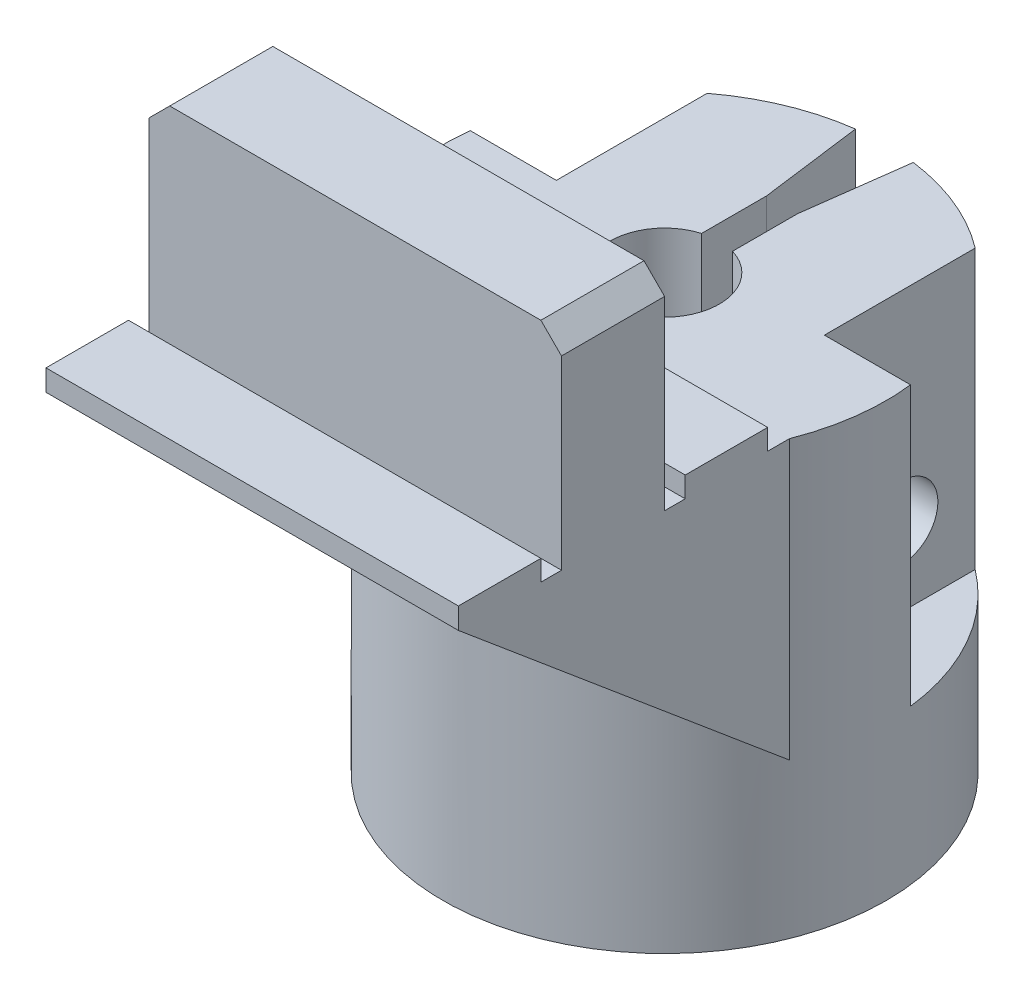
ISO-10303-21;
HEADER;
FILE_DESCRIPTION(('STEP AP214'),'2;1');
FILE_NAME('part.step','',(''),(''),'','','');
FILE_SCHEMA(('AUTOMOTIVE_DESIGN { 1 0 10303 214 1 1 1 1 }'));
ENDSEC;
DATA;
#1=APPLICATION_CONTEXT('core data for automotive mechanical design processes');
#2=APPLICATION_PROTOCOL_DEFINITION('international standard','automotive_design',2000,#1);
#3=PRODUCT_CONTEXT('',#1,'mechanical');
#4=PRODUCT('Part','Part','',(#3));
#5=PRODUCT_RELATED_PRODUCT_CATEGORY('part','',(#4));
#6=PRODUCT_DEFINITION_FORMATION('','',#4);
#7=PRODUCT_DEFINITION_CONTEXT('part definition',#1,'design');
#8=PRODUCT_DEFINITION('design','',#6,#7);
#9=PRODUCT_DEFINITION_SHAPE('','',#8);
#10=(LENGTH_UNIT() NAMED_UNIT(*) SI_UNIT(.MILLI.,.METRE.));
#11=(NAMED_UNIT(*) PLANE_ANGLE_UNIT() SI_UNIT($,.RADIAN.));
#12=(NAMED_UNIT(*) SI_UNIT($,.STERADIAN.) SOLID_ANGLE_UNIT());
#13=UNCERTAINTY_MEASURE_WITH_UNIT(LENGTH_MEASURE(1.E-05),#10,'distance_accuracy_value','');
#14=(GEOMETRIC_REPRESENTATION_CONTEXT(3) GLOBAL_UNCERTAINTY_ASSIGNED_CONTEXT((#13)) GLOBAL_UNIT_ASSIGNED_CONTEXT((#10,
#11,#12)) REPRESENTATION_CONTEXT('',''));
#15=CARTESIAN_POINT('',(0.,0.,0.));
#16=DIRECTION('',(0.,0.,1.));
#17=DIRECTION('',(1.,0.,0.));
#18=AXIS2_PLACEMENT_3D('',#15,#16,#17);
#19=CARTESIAN_POINT('',(0.,22.,0.));
#20=DIRECTION('',(0.,-1.,0.));
#21=DIRECTION('',(0.,0.,-1.));
#22=AXIS2_PLACEMENT_3D('',#19,#20,#21);
#23=PLANE('',#22);
#24=DIRECTION('',(-1.,0.,0.));
#25=VECTOR('',#24,1.);
#26=CARTESIAN_POINT('',(10.75,22.,9.));
#27=LINE('',#26,#25);
#28=CARTESIAN_POINT('',(10.,22.,9.));
#29=VERTEX_POINT('',#28);
#30=CARTESIAN_POINT('',(-10.,22.,9.));
#31=VERTEX_POINT('',#30);
#32=EDGE_CURVE('E269',#29,#31,#27,.T.);
#33=ORIENTED_EDGE('',*,*,#32,.F.);
#34=DIRECTION('',(0.,0.,-1.));
#35=VECTOR('',#34,1.);
#36=CARTESIAN_POINT('',(10.,22.,10.));
#37=LINE('',#36,#35);
#38=CARTESIAN_POINT('',(10.,22.,5.));
#39=VERTEX_POINT('',#38);
#40=EDGE_CURVE('E288',#29,#39,#37,.T.);
#41=ORIENTED_EDGE('',*,*,#40,.T.);
#42=DIRECTION('',(-1.,0.,0.));
#43=VECTOR('',#42,1.);
#44=CARTESIAN_POINT('',(-10.,22.,5.));
#45=LINE('',#44,#43);
#46=CARTESIAN_POINT('',(-10.,22.,5.));
#47=VERTEX_POINT('',#46);
#48=EDGE_CURVE('E289',#39,#47,#45,.T.);
#49=ORIENTED_EDGE('',*,*,#48,.T.);
#50=DIRECTION('',(0.,0.,1.));
#51=VECTOR('',#50,1.);
#52=CARTESIAN_POINT('',(-10.,22.,10.));
#53=LINE('',#52,#51);
#54=EDGE_CURVE('E283',#47,#31,#53,.T.);
#55=ORIENTED_EDGE('',*,*,#54,.T.);
#56=EDGE_LOOP('',(#33,#41,#49,#55));
#57=FACE_BOUND('',#56,.T.);
#58=ADVANCED_FACE('F44',(#57),#23,.F.);
#59=CARTESIAN_POINT('',(-10.,0.,0.));
#60=DIRECTION('',(1.,0.,0.));
#61=DIRECTION('',(0.,0.,-1.));
#62=AXIS2_PLACEMENT_3D('',#59,#60,#61);
#63=PLANE('',#62);
#64=DIRECTION('',(0.,0.,1.));
#65=VECTOR('',#64,1.);
#66=CARTESIAN_POINT('',(-10.,21.,15.));
#67=LINE('',#66,#65);
#68=CARTESIAN_POINT('',(-10.,21.,15.));
#69=VERTEX_POINT('',#68);
#70=CARTESIAN_POINT('',(-10.,21.,16.));
#71=VERTEX_POINT('',#70);
#72=EDGE_CURVE('E281',#69,#71,#67,.T.);
#73=ORIENTED_EDGE('',*,*,#72,.F.);
#74=DIRECTION('',(0.,-1.,0.));
#75=VECTOR('',#74,1.);
#76=CARTESIAN_POINT('',(-10.,31.,15.));
#77=LINE('',#76,#75);
#78=CARTESIAN_POINT('',(-10.,30.,15.));
#79=VERTEX_POINT('',#78);
#80=EDGE_CURVE('E67',#79,#69,#77,.T.);
#81=ORIENTED_EDGE('',*,*,#80,.F.);
#82=DIRECTION('',(0.,0.,-1.));
#83=VECTOR('',#82,1.);
#84=CARTESIAN_POINT('',(-10.,30.,10.));
#85=LINE('',#84,#83);
#86=CARTESIAN_POINT('',(-10.,30.,10.));
#87=VERTEX_POINT('',#86);
#88=EDGE_CURVE('E413',#79,#87,#85,.T.);
#89=ORIENTED_EDGE('',*,*,#88,.T.);
#90=DIRECTION('',(0.,-1.,0.));
#91=VECTOR('',#90,1.);
#92=CARTESIAN_POINT('',(-10.,31.,10.));
#93=LINE('',#92,#91);
#94=CARTESIAN_POINT('',(-10.,21.,10.));
#95=VERTEX_POINT('',#94);
#96=EDGE_CURVE('E299',#87,#95,#93,.T.);
#97=ORIENTED_EDGE('',*,*,#96,.T.);
#98=DIRECTION('',(0.,0.,1.));
#99=VECTOR('',#98,1.);
#100=CARTESIAN_POINT('',(-10.,21.,10.));
#101=LINE('',#100,#99);
#102=CARTESIAN_POINT('',(-10.,21.,9.));
#103=VERTEX_POINT('',#102);
#104=EDGE_CURVE('E271',#103,#95,#101,.T.);
#105=ORIENTED_EDGE('',*,*,#104,.F.);
#106=DIRECTION('',(0.,-1.,0.));
#107=VECTOR('',#106,1.);
#108=CARTESIAN_POINT('',(-10.,22.,9.));
#109=LINE('',#108,#107);
#110=EDGE_CURVE('E63',#31,#103,#109,.T.);
#111=ORIENTED_EDGE('',*,*,#110,.F.);
#112=ORIENTED_EDGE('',*,*,#54,.F.);
#113=DIRECTION('',(0.,-1.,0.));
#114=VECTOR('',#113,1.);
#115=CARTESIAN_POINT('',(-10.,22.,5.));
#116=LINE('',#115,#114);
#117=CARTESIAN_POINT('',(-10.,21.,5.));
#118=VERTEX_POINT('',#117);
#119=EDGE_CURVE('E524',#47,#118,#116,.T.);
#120=ORIENTED_EDGE('',*,*,#119,.T.);
#121=DIRECTION('',(0.,0.,-1.));
#122=VECTOR('',#121,1.);
#123=CARTESIAN_POINT('',(-10.,21.,10.));
#124=LINE('',#123,#122);
#125=CARTESIAN_POINT('',(-10.,21.,3.94493345951488));
#126=VERTEX_POINT('',#125);
#127=EDGE_CURVE('E320',#118,#126,#124,.T.);
#128=ORIENTED_EDGE('',*,*,#127,.T.);
#129=DIRECTION('',(0.,-1.,0.));
#130=VECTOR('',#129,1.);
#131=CARTESIAN_POINT('',(-10.,21.,3.94493345951487));
#132=LINE('',#131,#130);
#133=CARTESIAN_POINT('',(-10.,7.5,3.94493345951487));
#134=VERTEX_POINT('',#133);
#135=EDGE_CURVE('E313',#126,#134,#132,.T.);
#136=ORIENTED_EDGE('',*,*,#135,.T.);
#137=DIRECTION('',(0.,-0.64278760968654,-0.766044443118977));
#138=VECTOR('',#137,1.);
#139=CARTESIAN_POINT('',(-10.,16.7763022567614,15.));
#140=LINE('',#139,#138);
#141=CARTESIAN_POINT('',(-10.,20.9718004126478,20.));
#142=VERTEX_POINT('',#141);
#143=EDGE_CURVE('E309',#142,#134,#140,.T.);
#144=ORIENTED_EDGE('',*,*,#143,.F.);
#145=DIRECTION('',(0.,1.,0.));
#146=VECTOR('',#145,1.);
#147=CARTESIAN_POINT('',(-10.,20.9718004126478,20.));
#148=LINE('',#147,#146);
#149=CARTESIAN_POINT('',(-10.,22.,20.));
#150=VERTEX_POINT('',#149);
#151=EDGE_CURVE('E474',#142,#150,#148,.T.);
#152=ORIENTED_EDGE('',*,*,#151,.T.);
#153=DIRECTION('',(0.,0.,1.));
#154=VECTOR('',#153,1.);
#155=CARTESIAN_POINT('',(-10.,22.,17.5734253097148));
#156=LINE('',#155,#154);
#157=CARTESIAN_POINT('',(-10.,22.,16.));
#158=VERTEX_POINT('',#157);
#159=EDGE_CURVE('E519',#158,#150,#156,.T.);
#160=ORIENTED_EDGE('',*,*,#159,.F.);
#161=DIRECTION('',(0.,1.,0.));
#162=VECTOR('',#161,1.);
#163=CARTESIAN_POINT('',(-10.,22.,16.));
#164=LINE('',#163,#162);
#165=EDGE_CURVE('E811',#71,#158,#164,.T.);
#166=ORIENTED_EDGE('',*,*,#165,.F.);
#167=EDGE_LOOP('',(#73,#81,#89,#97,#105,#111,#112,#120,#128,#136,#144,#152,#160,#166));
#168=FACE_BOUND('',#167,.T.);
#169=ADVANCED_FACE('F277',(#168),#63,.F.);
#170=CARTESIAN_POINT('',(0.,21.,0.));
#171=DIRECTION('',(0.,1.,0.));
#172=DIRECTION('',(0.,0.,1.));
#173=AXIS2_PLACEMENT_3D('',#170,#171,#172);
#174=PLANE('',#173);
#175=DIRECTION('',(0.130526192220049,0.,0.991444861373811));
#176=VECTOR('',#175,1.);
#177=CARTESIAN_POINT('',(0.,21.,0.));
#178=LINE('',#177,#176);
#179=CARTESIAN_POINT('',(-1.40315656636553,21.,-10.6580322597685));
#180=VERTEX_POINT('',#179);
#181=CARTESIAN_POINT('',(-0.749999999999999,21.,-5.69681558454396));
#182=VERTEX_POINT('',#181);
#183=EDGE_CURVE('E493',#180,#182,#178,.T.);
#184=ORIENTED_EDGE('',*,*,#183,.F.);
#185=CARTESIAN_POINT('',(0.,21.,0.));
#186=DIRECTION('',(0.,-1.,0.));
#187=DIRECTION('',(0.,0.,-1.));
#188=AXIS2_PLACEMENT_3D('',#185,#186,#187);
#189=CIRCLE('',#188,10.75);
#190=CARTESIAN_POINT('',(-6.5,21.,-8.56227189477185));
#191=VERTEX_POINT('',#190);
#192=EDGE_CURVE('E404',#180,#191,#189,.F.);
#193=ORIENTED_EDGE('',*,*,#192,.T.);
#194=DIRECTION('',(0.,0.,-1.));
#195=VECTOR('',#194,1.);
#196=CARTESIAN_POINT('',(-6.5,21.,0.));
#197=LINE('',#196,#195);
#198=CARTESIAN_POINT('',(-6.5,21.,-1.25));
#199=VERTEX_POINT('',#198);
#200=EDGE_CURVE('E354',#199,#191,#197,.T.);
#201=ORIENTED_EDGE('',*,*,#200,.F.);
#202=DIRECTION('',(1.,0.,0.));
#203=VECTOR('',#202,1.);
#204=CARTESIAN_POINT('',(0.,21.,-1.25));
#205=LINE('',#204,#203);
#206=CARTESIAN_POINT('',(-10.6770782520313,21.,-1.25));
#207=VERTEX_POINT('',#206);
#208=EDGE_CURVE('E346',#207,#199,#205,.T.);
#209=ORIENTED_EDGE('',*,*,#208,.F.);
#210=EDGE_CURVE('E417',#207,#126,#189,.F.);
#211=ORIENTED_EDGE('',*,*,#210,.T.);
#212=ORIENTED_EDGE('',*,*,#127,.F.);
#213=DIRECTION('',(-1.,0.,0.));
#214=VECTOR('',#213,1.);
#215=CARTESIAN_POINT('',(-10.,21.,5.));
#216=LINE('',#215,#214);
#217=CARTESIAN_POINT('',(-0.750000000000002,21.,5.));
#218=VERTEX_POINT('',#217);
#219=EDGE_CURVE('E290',#218,#118,#216,.T.);
#220=ORIENTED_EDGE('',*,*,#219,.F.);
#221=DIRECTION('',(0.,0.,1.));
#222=VECTOR('',#221,1.);
#223=CARTESIAN_POINT('',(-0.750000000000001,21.,0.));
#224=LINE('',#223,#222);
#225=CARTESIAN_POINT('',(-0.750000000000002,21.,2.54165300542777));
#226=VERTEX_POINT('',#225);
#227=EDGE_CURVE('E365',#226,#218,#224,.T.);
#228=ORIENTED_EDGE('',*,*,#227,.F.);
#229=CARTESIAN_POINT('',(0.,21.,0.));
#230=DIRECTION('',(0.,1.,0.));
#231=DIRECTION('',(0.,0.,1.));
#232=AXIS2_PLACEMENT_3D('',#229,#230,#231);
#233=CIRCLE('',#232,2.65);
#234=CARTESIAN_POINT('',(-0.750000000000001,21.,-2.54165300542777));
#235=VERTEX_POINT('',#234);
#236=EDGE_CURVE('E391',#235,#226,#233,.T.);
#237=ORIENTED_EDGE('',*,*,#236,.F.);
#238=DIRECTION('',(0.,0.,1.));
#239=VECTOR('',#238,1.);
#240=CARTESIAN_POINT('',(-0.750000000000001,21.,0.));
#241=LINE('',#240,#239);
#242=EDGE_CURVE('E414',#182,#235,#241,.T.);
#243=ORIENTED_EDGE('',*,*,#242,.F.);
#244=EDGE_LOOP('',(#184,#193,#201,#209,#211,#212,#220,#228,#237,#243));
#245=FACE_BOUND('',#244,.T.);
#246=ADVANCED_FACE('F551',(#245),#174,.T.);
#247=CARTESIAN_POINT('',(10.,31.,15.));
#248=DIRECTION('',(0.,0.,-1.));
#249=DIRECTION('',(-1.,0.,0.));
#250=AXIS2_PLACEMENT_3D('',#247,#248,#249);
#251=PLANE('',#250);
#252=ORIENTED_EDGE('',*,*,#80,.T.);
#253=DIRECTION('',(-1.,0.,0.));
#254=VECTOR('',#253,1.);
#255=CARTESIAN_POINT('',(10.75,21.,15.));
#256=LINE('',#255,#254);
#257=CARTESIAN_POINT('',(10.,21.,15.));
#258=VERTEX_POINT('',#257);
#259=EDGE_CURVE('E459',#258,#69,#256,.T.);
#260=ORIENTED_EDGE('',*,*,#259,.F.);
#261=DIRECTION('',(0.,-1.,0.));
#262=VECTOR('',#261,1.);
#263=CARTESIAN_POINT('',(10.,31.,15.));
#264=LINE('',#263,#262);
#265=CARTESIAN_POINT('',(10.,30.,15.));
#266=VERTEX_POINT('',#265);
#267=EDGE_CURVE('E298',#266,#258,#264,.T.);
#268=ORIENTED_EDGE('',*,*,#267,.F.);
#269=DIRECTION('',(0.707106781186545,-0.70710678118655,0.));
#270=VECTOR('',#269,1.);
#271=CARTESIAN_POINT('',(8.99999999999999,31.,15.));
#272=LINE('',#271,#270);
#273=CARTESIAN_POINT('',(8.99999999999999,31.,15.));
#274=VERTEX_POINT('',#273);
#275=EDGE_CURVE('E433',#266,#274,#272,.F.);
#276=ORIENTED_EDGE('',*,*,#275,.T.);
#277=DIRECTION('',(-1.,0.,0.));
#278=VECTOR('',#277,1.);
#279=CARTESIAN_POINT('',(10.,31.,15.));
#280=LINE('',#279,#278);
#281=CARTESIAN_POINT('',(-9.,31.,15.));
#282=VERTEX_POINT('',#281);
#283=EDGE_CURVE('E308',#274,#282,#280,.T.);
#284=ORIENTED_EDGE('',*,*,#283,.T.);
#285=DIRECTION('',(-0.707106781186548,-0.707106781186548,0.));
#286=VECTOR('',#285,1.);
#287=CARTESIAN_POINT('',(-10.,30.,15.));
#288=LINE('',#287,#286);
#289=EDGE_CURVE('E434',#282,#79,#288,.T.);
#290=ORIENTED_EDGE('',*,*,#289,.T.);
#291=EDGE_LOOP('',(#252,#260,#268,#276,#284,#290));
#292=FACE_BOUND('',#291,.T.);
#293=ADVANCED_FACE('F635',(#292),#251,.F.);
#294=CARTESIAN_POINT('',(-0.75,0.,-10.75));
#295=DIRECTION('',(-1.,0.,0.));
#296=DIRECTION('',(0.,0.,1.));
#297=AXIS2_PLACEMENT_3D('',#294,#295,#296);
#298=PLANE('',#297);
#299=ORIENTED_EDGE('',*,*,#227,.T.);
#300=DIRECTION('',(0.,1.,0.));
#301=VECTOR('',#300,1.);
#302=CARTESIAN_POINT('',(-0.750000000000002,0.,5.));
#303=LINE('',#302,#301);
#304=CARTESIAN_POINT('',(-0.750000000000002,0.,5.));
#305=VERTEX_POINT('',#304);
#306=EDGE_CURVE('E514',#305,#218,#303,.T.);
#307=ORIENTED_EDGE('',*,*,#306,.F.);
#308=DIRECTION('',(0.,0.,1.));
#309=VECTOR('',#308,1.);
#310=CARTESIAN_POINT('',(-0.75,0.,-10.75));
#311=LINE('',#310,#309);
#312=CARTESIAN_POINT('',(-0.750000000000002,0.,2.54165300542777));
#313=VERTEX_POINT('',#312);
#314=EDGE_CURVE('E382',#313,#305,#311,.T.);
#315=ORIENTED_EDGE('',*,*,#314,.F.);
#316=DIRECTION('',(0.,-1.,0.));
#317=VECTOR('',#316,1.);
#318=CARTESIAN_POINT('',(-0.750000000000002,21.,2.54165300542777));
#319=LINE('',#318,#317);
#320=EDGE_CURVE('E408',#313,#226,#319,.F.);
#321=ORIENTED_EDGE('',*,*,#320,.T.);
#322=EDGE_LOOP('',(#299,#307,#315,#321));
#323=FACE_BOUND('',#322,.T.);
#324=ADVANCED_FACE('F588',(#323),#298,.F.);
#325=CARTESIAN_POINT('',(0.75,0.,-10.75));
#326=DIRECTION('',(1.,0.,0.));
#327=DIRECTION('',(0.,0.,-1.));
#328=AXIS2_PLACEMENT_3D('',#325,#326,#327);
#329=PLANE('',#328);
#330=DIRECTION('',(0.,0.,-1.));
#331=VECTOR('',#330,1.);
#332=CARTESIAN_POINT('',(0.75,0.,-10.75));
#333=LINE('',#332,#331);
#334=CARTESIAN_POINT('',(0.750000000000002,0.,5.));
#335=VERTEX_POINT('',#334);
#336=CARTESIAN_POINT('',(0.750000000000002,0.,2.54165300542777));
#337=VERTEX_POINT('',#336);
#338=EDGE_CURVE('E383',#335,#337,#333,.T.);
#339=ORIENTED_EDGE('',*,*,#338,.F.);
#340=DIRECTION('',(0.,1.,0.));
#341=VECTOR('',#340,1.);
#342=CARTESIAN_POINT('',(0.750000000000002,0.,5.));
#343=LINE('',#342,#341);
#344=CARTESIAN_POINT('',(0.750000000000002,21.,5.));
#345=VERTEX_POINT('',#344);
#346=EDGE_CURVE('E511',#335,#345,#343,.T.);
#347=ORIENTED_EDGE('',*,*,#346,.T.);
#348=DIRECTION('',(0.,0.,-1.));
#349=VECTOR('',#348,1.);
#350=CARTESIAN_POINT('',(0.750000000000001,21.,0.));
#351=LINE('',#350,#349);
#352=CARTESIAN_POINT('',(0.750000000000002,21.,2.54165300542777));
#353=VERTEX_POINT('',#352);
#354=EDGE_CURVE('E381',#345,#353,#351,.T.);
#355=ORIENTED_EDGE('',*,*,#354,.T.);
#356=DIRECTION('',(0.,-1.,0.));
#357=VECTOR('',#356,1.);
#358=CARTESIAN_POINT('',(0.750000000000002,21.,2.54165300542777));
#359=LINE('',#358,#357);
#360=EDGE_CURVE('E401',#353,#337,#359,.T.);
#361=ORIENTED_EDGE('',*,*,#360,.T.);
#362=EDGE_LOOP('',(#339,#347,#355,#361));
#363=FACE_BOUND('',#362,.T.);
#364=ADVANCED_FACE('F640',(#363),#329,.F.);
#365=CARTESIAN_POINT('',(0.,21.,0.));
#366=DIRECTION('',(0.,-1.,0.));
#367=DIRECTION('',(0.,0.,-1.));
#368=AXIS2_PLACEMENT_3D('',#365,#366,#367);
#369=CYLINDRICAL_SURFACE('',#368,10.75);
#370=CARTESIAN_POINT('',(0.,0.,0.));
#371=DIRECTION('',(0.,1.,0.));
#372=DIRECTION('',(0.,0.,1.));
#373=AXIS2_PLACEMENT_3D('',#370,#371,#372);
#374=CIRCLE('',#373,10.75);
#375=CARTESIAN_POINT('',(-1.40315656636553,0.,-10.6580322597685));
#376=VERTEX_POINT('',#375);
#377=CARTESIAN_POINT('',(1.40315656636553,0.,-10.6580322597685));
#378=VERTEX_POINT('',#377);
#379=EDGE_CURVE('E392',#376,#378,#374,.T.);
#380=ORIENTED_EDGE('',*,*,#379,.T.);
#381=DIRECTION('',(0.,-1.,0.));
#382=VECTOR('',#381,1.);
#383=CARTESIAN_POINT('',(1.40315656636553,21.,-10.6580322597685));
#384=LINE('',#383,#382);
#385=CARTESIAN_POINT('',(1.40315656636553,21.,-10.6580322597685));
#386=VERTEX_POINT('',#385);
#387=EDGE_CURVE('E499',#378,#386,#384,.F.);
#388=ORIENTED_EDGE('',*,*,#387,.T.);
#389=CARTESIAN_POINT('',(6.5,21.,-8.56227189477185));
#390=VERTEX_POINT('',#389);
#391=EDGE_CURVE('E396',#390,#386,#189,.F.);
#392=ORIENTED_EDGE('',*,*,#391,.F.);
#393=DIRECTION('',(0.,1.,0.));
#394=VECTOR('',#393,1.);
#395=CARTESIAN_POINT('',(6.5,-8.42124117851183,-8.56227189477185));
#396=LINE('',#395,#394);
#397=CARTESIAN_POINT('',(6.5,7.5,-8.56227189477185));
#398=VERTEX_POINT('',#397);
#399=EDGE_CURVE('E370',#398,#390,#396,.T.);
#400=ORIENTED_EDGE('',*,*,#399,.F.);
#401=CARTESIAN_POINT('',(0.,7.5,0.));
#402=DIRECTION('',(0.,1.,0.));
#403=DIRECTION('',(0.,0.,1.));
#404=AXIS2_PLACEMENT_3D('',#401,#402,#403);
#405=CIRCLE('',#404,10.75);
#406=CARTESIAN_POINT('',(10.6770782520313,7.5,-1.25));
#407=VERTEX_POINT('',#406);
#408=EDGE_CURVE('E361',#398,#407,#405,.F.);
#409=ORIENTED_EDGE('',*,*,#408,.T.);
#410=DIRECTION('',(0.,1.,0.));
#411=VECTOR('',#410,1.);
#412=CARTESIAN_POINT('',(10.6770782520313,-8.42124117851183,-1.25));
#413=LINE('',#412,#411);
#414=CARTESIAN_POINT('',(10.6770782520313,21.,-1.25));
#415=VERTEX_POINT('',#414);
#416=EDGE_CURVE('E376',#407,#415,#413,.T.);
#417=ORIENTED_EDGE('',*,*,#416,.T.);
#418=CARTESIAN_POINT('',(10.,21.,3.94493345951488));
#419=VERTEX_POINT('',#418);
#420=EDGE_CURVE('E423',#419,#415,#189,.F.);
#421=ORIENTED_EDGE('',*,*,#420,.F.);
#422=DIRECTION('',(0.,-1.,0.));
#423=VECTOR('',#422,1.);
#424=CARTESIAN_POINT('',(10.,21.,3.94493345951487));
#425=LINE('',#424,#423);
#426=CARTESIAN_POINT('',(10.,7.5,3.94493345951487));
#427=VERTEX_POINT('',#426);
#428=EDGE_CURVE('E305',#419,#427,#425,.T.);
#429=ORIENTED_EDGE('',*,*,#428,.T.);
#430=CARTESIAN_POINT('',(0.,4.18980778910215,0.));
#431=DIRECTION('',(0.,0.766044443118977,-0.64278760968654));
#432=DIRECTION('',(0.,-0.64278760968654,-0.766044443118977));
#433=AXIS2_PLACEMENT_3D('',#430,#431,#432);
#434=ELLIPSE('',#433,14.033128360322,10.75);
#435=EDGE_CURVE('E324',#134,#427,#434,.T.);
#436=ORIENTED_EDGE('',*,*,#435,.F.);
#437=ORIENTED_EDGE('',*,*,#135,.F.);
#438=ORIENTED_EDGE('',*,*,#210,.F.);
#439=DIRECTION('',(0.,1.,0.));
#440=VECTOR('',#439,1.);
#441=CARTESIAN_POINT('',(-10.6770782520313,-8.42124117851183,-1.25));
#442=LINE('',#441,#440);
#443=CARTESIAN_POINT('',(-10.6770782520313,7.5,-1.25));
#444=VERTEX_POINT('',#443);
#445=EDGE_CURVE('E344',#444,#207,#442,.T.);
#446=ORIENTED_EDGE('',*,*,#445,.F.);
#447=CARTESIAN_POINT('',(0.,7.5,0.));
#448=DIRECTION('',(0.,1.,0.));
#449=DIRECTION('',(0.,0.,1.));
#450=AXIS2_PLACEMENT_3D('',#447,#448,#449);
#451=CIRCLE('',#450,10.75);
#452=CARTESIAN_POINT('',(-6.5,7.5,-8.56227189477185));
#453=VERTEX_POINT('',#452);
#454=EDGE_CURVE('E343',#444,#453,#451,.F.);
#455=ORIENTED_EDGE('',*,*,#454,.T.);
#456=DIRECTION('',(0.,1.,0.));
#457=VECTOR('',#456,1.);
#458=CARTESIAN_POINT('',(-6.5,-8.42124117851183,-8.56227189477185));
#459=LINE('',#458,#457);
#460=EDGE_CURVE('E357',#453,#191,#459,.T.);
#461=ORIENTED_EDGE('',*,*,#460,.T.);
#462=ORIENTED_EDGE('',*,*,#192,.F.);
#463=DIRECTION('',(0.,-1.,0.));
#464=VECTOR('',#463,1.);
#465=CARTESIAN_POINT('',(-1.40315656636553,21.,-10.6580322597685));
#466=LINE('',#465,#464);
#467=EDGE_CURVE('E510',#180,#376,#466,.T.);
#468=ORIENTED_EDGE('',*,*,#467,.T.);
#469=EDGE_LOOP('',(#380,#388,#392,#400,#409,#417,#421,#429,#436,#437,#438,#446,#455,#461,#462,#468));
#470=FACE_BOUND('',#469,.T.);
#471=ADVANCED_FACE('F539',(#470),#369,.T.);
#472=CARTESIAN_POINT('',(0.,21.,0.));
#473=DIRECTION('',(0.,-1.,0.));
#474=DIRECTION('',(0.,0.,-1.));
#475=AXIS2_PLACEMENT_3D('',#472,#473,#474);
#476=CYLINDRICAL_SURFACE('',#475,2.65);
#477=DIRECTION('',(0.,-1.,0.));
#478=VECTOR('',#477,1.);
#479=CARTESIAN_POINT('',(-0.750000000000001,21.,-2.54165300542777));
#480=LINE('',#479,#478);
#481=CARTESIAN_POINT('',(-0.750000000000001,0.,-2.54165300542777));
#482=VERTEX_POINT('',#481);
#483=EDGE_CURVE('E406',#235,#482,#480,.T.);
#484=ORIENTED_EDGE('',*,*,#483,.F.);
#485=ORIENTED_EDGE('',*,*,#236,.T.);
#486=ORIENTED_EDGE('',*,*,#320,.F.);
#487=CARTESIAN_POINT('',(0.,0.,0.));
#488=DIRECTION('',(0.,1.,0.));
#489=DIRECTION('',(0.,0.,1.));
#490=AXIS2_PLACEMENT_3D('',#487,#488,#489);
#491=CIRCLE('',#490,2.65);
#492=EDGE_CURVE('E386',#482,#313,#491,.T.);
#493=ORIENTED_EDGE('',*,*,#492,.F.);
#494=EDGE_LOOP('',(#484,#485,#486,#493));
#495=FACE_BOUND('',#494,.T.);
#496=ADVANCED_FACE('F581',(#495),#476,.F.);
#497=DIRECTION('',(0.130526192220049,0.,-0.991444861373811));
#498=VECTOR('',#497,1.);
#499=CARTESIAN_POINT('',(1.41526434906448,21.,-10.75));
#500=LINE('',#499,#498);
#501=CARTESIAN_POINT('',(0.750000000000001,21.,-5.69681558454398));
#502=VERTEX_POINT('',#501);
#503=EDGE_CURVE('E476',#502,#386,#500,.T.);
#504=ORIENTED_EDGE('',*,*,#503,.F.);
#505=DIRECTION('',(0.,0.,-1.));
#506=VECTOR('',#505,1.);
#507=CARTESIAN_POINT('',(0.750000000000001,21.,0.));
#508=LINE('',#507,#506);
#509=CARTESIAN_POINT('',(0.750000000000001,21.,-2.54165300542777));
#510=VERTEX_POINT('',#509);
#511=EDGE_CURVE('E415',#510,#502,#508,.T.);
#512=ORIENTED_EDGE('',*,*,#511,.F.);
#513=EDGE_CURVE('E400',#353,#510,#233,.T.);
#514=ORIENTED_EDGE('',*,*,#513,.F.);
#515=ORIENTED_EDGE('',*,*,#354,.F.);
#516=CARTESIAN_POINT('',(10.,21.,5.));
#517=VERTEX_POINT('',#516);
#518=EDGE_CURVE('E293',#517,#345,#216,.T.);
#519=ORIENTED_EDGE('',*,*,#518,.F.);
#520=DIRECTION('',(0.,0.,-1.));
#521=VECTOR('',#520,1.);
#522=CARTESIAN_POINT('',(10.,21.,10.));
#523=LINE('',#522,#521);
#524=EDGE_CURVE('E302',#517,#419,#523,.T.);
#525=ORIENTED_EDGE('',*,*,#524,.T.);
#526=ORIENTED_EDGE('',*,*,#420,.T.);
#527=DIRECTION('',(1.,0.,0.));
#528=VECTOR('',#527,1.);
#529=CARTESIAN_POINT('',(0.,21.,-1.25));
#530=LINE('',#529,#528);
#531=CARTESIAN_POINT('',(6.5,21.,-1.25));
#532=VERTEX_POINT('',#531);
#533=EDGE_CURVE('E371',#532,#415,#530,.T.);
#534=ORIENTED_EDGE('',*,*,#533,.F.);
#535=DIRECTION('',(0.,0.,1.));
#536=VECTOR('',#535,1.);
#537=CARTESIAN_POINT('',(6.5,21.,0.));
#538=LINE('',#537,#536);
#539=EDGE_CURVE('E338',#390,#532,#538,.T.);
#540=ORIENTED_EDGE('',*,*,#539,.F.);
#541=ORIENTED_EDGE('',*,*,#391,.T.);
#542=EDGE_LOOP('',(#504,#512,#514,#515,#519,#525,#526,#534,#540,#541));
#543=FACE_BOUND('',#542,.T.);
#544=ADVANCED_FACE('F533',(#543),#174,.T.);
#545=CARTESIAN_POINT('',(0.,0.,0.));
#546=DIRECTION('',(0.,1.,0.));
#547=DIRECTION('',(0.,0.,1.));
#548=AXIS2_PLACEMENT_3D('',#545,#546,#547);
#549=PLANE('',#548);
#550=CARTESIAN_POINT('',(0.750000000000001,0.,-2.54165300542777));
#551=VERTEX_POINT('',#550);
#552=CARTESIAN_POINT('',(0.750000000000001,0.,-5.69681558454398));
#553=VERTEX_POINT('',#552);
#554=EDGE_CURVE('E387',#551,#553,#333,.T.);
#555=ORIENTED_EDGE('',*,*,#554,.T.);
#556=DIRECTION('',(0.130526192220049,0.,-0.991444861373811));
#557=VECTOR('',#556,1.);
#558=CARTESIAN_POINT('',(1.41526434906448,0.,-10.75));
#559=LINE('',#558,#557);
#560=EDGE_CURVE('E487',#553,#378,#559,.T.);
#561=ORIENTED_EDGE('',*,*,#560,.T.);
#562=ORIENTED_EDGE('',*,*,#379,.F.);
#563=DIRECTION('',(0.130526192220049,0.,0.991444861373811));
#564=VECTOR('',#563,1.);
#565=CARTESIAN_POINT('',(0.,0.,0.));
#566=LINE('',#565,#564);
#567=CARTESIAN_POINT('',(-0.749999999999999,0.,-5.69681558454396));
#568=VERTEX_POINT('',#567);
#569=EDGE_CURVE('E489',#376,#568,#566,.T.);
#570=ORIENTED_EDGE('',*,*,#569,.T.);
#571=EDGE_CURVE('E384',#568,#482,#311,.T.);
#572=ORIENTED_EDGE('',*,*,#571,.T.);
#573=ORIENTED_EDGE('',*,*,#492,.T.);
#574=ORIENTED_EDGE('',*,*,#314,.T.);
#575=DIRECTION('',(1.,0.,0.));
#576=VECTOR('',#575,1.);
#577=CARTESIAN_POINT('',(-0.750000000000002,0.,5.));
#578=LINE('',#577,#576);
#579=EDGE_CURVE('E509',#305,#335,#578,.T.);
#580=ORIENTED_EDGE('',*,*,#579,.T.);
#581=ORIENTED_EDGE('',*,*,#338,.T.);
#582=EDGE_CURVE('E389',#337,#551,#491,.T.);
#583=ORIENTED_EDGE('',*,*,#582,.T.);
#584=EDGE_LOOP('',(#555,#561,#562,#570,#572,#573,#574,#580,#581,#583));
#585=FACE_BOUND('',#584,.T.);
#586=ADVANCED_FACE('F570',(#585),#549,.F.);
#587=ORIENTED_EDGE('',*,*,#360,.F.);
#588=ORIENTED_EDGE('',*,*,#513,.T.);
#589=DIRECTION('',(0.,-1.,0.));
#590=VECTOR('',#589,1.);
#591=CARTESIAN_POINT('',(0.750000000000001,21.,-2.54165300542777));
#592=LINE('',#591,#590);
#593=EDGE_CURVE('E402',#551,#510,#592,.F.);
#594=ORIENTED_EDGE('',*,*,#593,.F.);
#595=ORIENTED_EDGE('',*,*,#582,.F.);
#596=EDGE_LOOP('',(#587,#588,#594,#595));
#597=FACE_BOUND('',#596,.T.);
#598=ADVANCED_FACE('F594',(#597),#476,.F.);
#599=ORIENTED_EDGE('',*,*,#511,.T.);
#600=DIRECTION('',(0.,-1.,0.));
#601=VECTOR('',#600,1.);
#602=CARTESIAN_POINT('',(0.750000000000001,0.,-5.69681558454398));
#603=LINE('',#602,#601);
#604=CARTESIAN_POINT('',(0.750000000000001,12.8552875260017,-5.69681558454398));
#605=VERTEX_POINT('',#604);
#606=EDGE_CURVE('E497',#502,#605,#603,.T.);
#607=ORIENTED_EDGE('',*,*,#606,.T.);
#608=CARTESIAN_POINT('',(0.750000000000001,11.25,-5.));
#609=DIRECTION('',(1.,0.,0.));
#610=DIRECTION('',(0.,0.,-1.));
#611=AXIS2_PLACEMENT_3D('',#608,#609,#610);
#612=CIRCLE('',#611,1.75);
#613=CARTESIAN_POINT('',(0.750000000000001,9.64471247399831,-5.69681558454398));
#614=VERTEX_POINT('',#613);
#615=EDGE_CURVE('E340',#605,#614,#612,.T.);
#616=ORIENTED_EDGE('',*,*,#615,.T.);
#617=EDGE_CURVE('E494',#614,#553,#603,.T.);
#618=ORIENTED_EDGE('',*,*,#617,.T.);
#619=ORIENTED_EDGE('',*,*,#554,.F.);
#620=ORIENTED_EDGE('',*,*,#593,.T.);
#621=EDGE_LOOP('',(#599,#607,#616,#618,#619,#620));
#622=FACE_BOUND('',#621,.T.);
#623=ADVANCED_FACE('F591',(#622),#329,.F.);
#624=ORIENTED_EDGE('',*,*,#571,.F.);
#625=DIRECTION('',(0.,1.,0.));
#626=VECTOR('',#625,1.);
#627=CARTESIAN_POINT('',(-0.750000000000001,0.,-5.69681558454398));
#628=LINE('',#627,#626);
#629=CARTESIAN_POINT('',(-0.750000000000001,9.64471247399831,-5.69681558454398));
#630=VERTEX_POINT('',#629);
#631=EDGE_CURVE('E506',#568,#630,#628,.T.);
#632=ORIENTED_EDGE('',*,*,#631,.T.);
#633=CARTESIAN_POINT('',(-0.750000000000001,11.25,-5.));
#634=DIRECTION('',(-1.,0.,0.));
#635=DIRECTION('',(0.,0.,1.));
#636=AXIS2_PLACEMENT_3D('',#633,#634,#635);
#637=CIRCLE('',#636,1.75);
#638=CARTESIAN_POINT('',(-0.750000000000001,12.8552875260017,-5.69681558454398));
#639=VERTEX_POINT('',#638);
#640=EDGE_CURVE('E333',#630,#639,#637,.T.);
#641=ORIENTED_EDGE('',*,*,#640,.T.);
#642=EDGE_CURVE('E503',#639,#182,#628,.T.);
#643=ORIENTED_EDGE('',*,*,#642,.T.);
#644=ORIENTED_EDGE('',*,*,#242,.T.);
#645=ORIENTED_EDGE('',*,*,#483,.T.);
#646=EDGE_LOOP('',(#624,#632,#641,#643,#644,#645));
#647=FACE_BOUND('',#646,.T.);
#648=ADVANCED_FACE('F580',(#647),#298,.F.);
#649=CARTESIAN_POINT('',(6.5,-8.42124117851183,0.));
#650=DIRECTION('',(-1.,0.,0.));
#651=DIRECTION('',(0.,0.,1.));
#652=AXIS2_PLACEMENT_3D('',#649,#650,#651);
#653=PLANE('',#652);
#654=CARTESIAN_POINT('',(6.5,11.25,-5.));
#655=DIRECTION('',(-1.,0.,0.));
#656=DIRECTION('',(0.,0.,1.));
#657=AXIS2_PLACEMENT_3D('',#654,#655,#656);
#658=CIRCLE('',#657,1.75);
#659=CARTESIAN_POINT('',(6.5,11.25,-3.25));
#660=VERTEX_POINT('',#659);
#661=EDGE_CURVE('E334',#660,#660,#658,.T.);
#662=ORIENTED_EDGE('',*,*,#661,.T.);
#663=EDGE_LOOP('',(#662));
#664=FACE_BOUND('',#663,.T.);
#665=DIRECTION('',(0.,0.,-1.));
#666=VECTOR('',#665,1.);
#667=CARTESIAN_POINT('',(6.5,7.5,0.));
#668=LINE('',#667,#666);
#669=CARTESIAN_POINT('',(6.5,7.5,-1.25));
#670=VERTEX_POINT('',#669);
#671=EDGE_CURVE('E366',#670,#398,#668,.T.);
#672=ORIENTED_EDGE('',*,*,#671,.T.);
#673=ORIENTED_EDGE('',*,*,#399,.T.);
#674=ORIENTED_EDGE('',*,*,#539,.T.);
#675=DIRECTION('',(0.,1.,0.));
#676=VECTOR('',#675,1.);
#677=CARTESIAN_POINT('',(6.5,-8.42124117851183,-1.25));
#678=LINE('',#677,#676);
#679=EDGE_CURVE('E372',#670,#532,#678,.T.);
#680=ORIENTED_EDGE('',*,*,#679,.F.);
#681=EDGE_LOOP('',(#672,#673,#674,#680));
#682=FACE_BOUND('',#681,.T.);
#683=ADVANCED_FACE('F661',(#664,#682),#653,.F.);
#684=CARTESIAN_POINT('',(0.,-8.42124117851183,-1.25));
#685=DIRECTION('',(0.,0.,1.));
#686=DIRECTION('',(1.,0.,0.));
#687=AXIS2_PLACEMENT_3D('',#684,#685,#686);
#688=PLANE('',#687);
#689=DIRECTION('',(-1.,0.,0.));
#690=VECTOR('',#689,1.);
#691=CARTESIAN_POINT('',(0.,7.5,-1.25));
#692=LINE('',#691,#690);
#693=EDGE_CURVE('E351',#407,#670,#692,.T.);
#694=ORIENTED_EDGE('',*,*,#693,.T.);
#695=ORIENTED_EDGE('',*,*,#679,.T.);
#696=ORIENTED_EDGE('',*,*,#533,.T.);
#697=ORIENTED_EDGE('',*,*,#416,.F.);
#698=EDGE_LOOP('',(#694,#695,#696,#697));
#699=FACE_BOUND('',#698,.T.);
#700=ADVANCED_FACE('F861',(#699),#688,.F.);
#701=CARTESIAN_POINT('',(0.,7.5,0.));
#702=DIRECTION('',(0.,1.,0.));
#703=DIRECTION('',(0.,0.,1.));
#704=AXIS2_PLACEMENT_3D('',#701,#702,#703);
#705=PLANE('',#704);
#706=ORIENTED_EDGE('',*,*,#671,.F.);
#707=ORIENTED_EDGE('',*,*,#693,.F.);
#708=ORIENTED_EDGE('',*,*,#408,.F.);
#709=EDGE_LOOP('',(#706,#707,#708));
#710=FACE_BOUND('',#709,.T.);
#711=ADVANCED_FACE('F880',(#710),#705,.T.);
#712=CARTESIAN_POINT('',(0.,-8.42124117851183,-1.25));
#713=DIRECTION('',(0.,0.,1.));
#714=DIRECTION('',(1.,0.,0.));
#715=AXIS2_PLACEMENT_3D('',#712,#713,#714);
#716=PLANE('',#715);
#717=DIRECTION('',(-1.,0.,0.));
#718=VECTOR('',#717,1.);
#719=CARTESIAN_POINT('',(0.,7.5,-1.25));
#720=LINE('',#719,#718);
#721=CARTESIAN_POINT('',(-6.5,7.5,-1.25));
#722=VERTEX_POINT('',#721);
#723=EDGE_CURVE('E342',#722,#444,#720,.T.);
#724=ORIENTED_EDGE('',*,*,#723,.T.);
#725=ORIENTED_EDGE('',*,*,#445,.T.);
#726=ORIENTED_EDGE('',*,*,#208,.T.);
#727=DIRECTION('',(0.,1.,0.));
#728=VECTOR('',#727,1.);
#729=CARTESIAN_POINT('',(-6.5,-8.42124117851183,-1.25));
#730=LINE('',#729,#728);
#731=EDGE_CURVE('E352',#722,#199,#730,.T.);
#732=ORIENTED_EDGE('',*,*,#731,.F.);
#733=EDGE_LOOP('',(#724,#725,#726,#732));
#734=FACE_BOUND('',#733,.T.);
#735=ADVANCED_FACE('F851',(#734),#716,.F.);
#736=CARTESIAN_POINT('',(-6.5,-8.42124117851183,0.));
#737=DIRECTION('',(1.,0.,0.));
#738=DIRECTION('',(0.,0.,-1.));
#739=AXIS2_PLACEMENT_3D('',#736,#737,#738);
#740=PLANE('',#739);
#741=CARTESIAN_POINT('',(-6.5,11.25,-5.));
#742=DIRECTION('',(-1.,0.,0.));
#743=DIRECTION('',(0.,0.,1.));
#744=AXIS2_PLACEMENT_3D('',#741,#742,#743);
#745=CIRCLE('',#744,1.75);
#746=CARTESIAN_POINT('',(-6.5,11.25,-3.25));
#747=VERTEX_POINT('',#746);
#748=EDGE_CURVE('E326',#747,#747,#745,.T.);
#749=ORIENTED_EDGE('',*,*,#748,.F.);
#750=EDGE_LOOP('',(#749));
#751=FACE_BOUND('',#750,.T.);
#752=DIRECTION('',(0.,0.,1.));
#753=VECTOR('',#752,1.);
#754=CARTESIAN_POINT('',(-6.5,7.5,0.));
#755=LINE('',#754,#753);
#756=EDGE_CURVE('E350',#453,#722,#755,.T.);
#757=ORIENTED_EDGE('',*,*,#756,.T.);
#758=ORIENTED_EDGE('',*,*,#731,.T.);
#759=ORIENTED_EDGE('',*,*,#200,.T.);
#760=ORIENTED_EDGE('',*,*,#460,.F.);
#761=EDGE_LOOP('',(#757,#758,#759,#760));
#762=FACE_BOUND('',#761,.T.);
#763=ADVANCED_FACE('F846',(#751,#762),#740,.F.);
#764=CARTESIAN_POINT('',(0.,7.5,0.));
#765=DIRECTION('',(0.,1.,0.));
#766=DIRECTION('',(0.,0.,1.));
#767=AXIS2_PLACEMENT_3D('',#764,#765,#766);
#768=PLANE('',#767);
#769=ORIENTED_EDGE('',*,*,#723,.F.);
#770=ORIENTED_EDGE('',*,*,#756,.F.);
#771=ORIENTED_EDGE('',*,*,#454,.F.);
#772=EDGE_LOOP('',(#769,#770,#771));
#773=FACE_BOUND('',#772,.T.);
#774=ADVANCED_FACE('F606',(#773),#768,.T.);
#775=CARTESIAN_POINT('',(10.75,11.25,-5.));
#776=DIRECTION('',(-1.,0.,0.));
#777=DIRECTION('',(0.,0.,1.));
#778=AXIS2_PLACEMENT_3D('',#775,#776,#777);
#779=CYLINDRICAL_SURFACE('',#778,1.75);
#780=ORIENTED_EDGE('',*,*,#748,.T.);
#781=EDGE_LOOP('',(#780));
#782=FACE_BOUND('',#781,.T.);
#783=ORIENTED_EDGE('',*,*,#640,.F.);
#784=CARTESIAN_POINT('',(-0.658262487936967,11.25,-5.));
#785=DIRECTION('',(-0.991444861373811,0.,0.130526192220049));
#786=DIRECTION('',(-0.130526192220049,0.,-0.991444861373811));
#787=AXIS2_PLACEMENT_3D('',#784,#785,#786);
#788=ELLIPSE('',#787,1.76510068101527,1.75);
#789=EDGE_CURVE('E445',#630,#639,#788,.F.);
#790=ORIENTED_EDGE('',*,*,#789,.T.);
#791=EDGE_LOOP('',(#783,#790));
#792=FACE_BOUND('',#791,.T.);
#793=ADVANCED_FACE('F596',(#782,#792),#779,.F.);
#794=ORIENTED_EDGE('',*,*,#661,.F.);
#795=EDGE_LOOP('',(#794));
#796=FACE_BOUND('',#795,.T.);
#797=ORIENTED_EDGE('',*,*,#615,.F.);
#798=CARTESIAN_POINT('',(0.658262487936967,11.25,-5.));
#799=DIRECTION('',(0.991444861373811,0.,0.130526192220049));
#800=DIRECTION('',(-0.130526192220049,0.,0.991444861373811));
#801=AXIS2_PLACEMENT_3D('',#798,#799,#800);
#802=ELLIPSE('',#801,1.76510068101527,1.75);
#803=EDGE_CURVE('E437',#605,#614,#802,.F.);
#804=ORIENTED_EDGE('',*,*,#803,.T.);
#805=EDGE_LOOP('',(#797,#804));
#806=FACE_BOUND('',#805,.T.);
#807=ADVANCED_FACE('F597',(#796,#806),#779,.F.);
#808=CARTESIAN_POINT('',(10.,16.7763022567614,15.));
#809=DIRECTION('',(0.,0.766044443118977,-0.64278760968654));
#810=DIRECTION('',(0.,0.64278760968654,0.766044443118977));
#811=AXIS2_PLACEMENT_3D('',#808,#809,#810);
#812=PLANE('',#811);
#813=ORIENTED_EDGE('',*,*,#143,.T.);
#814=ORIENTED_EDGE('',*,*,#435,.T.);
#815=DIRECTION('',(0.,-0.64278760968654,-0.766044443118977));
#816=VECTOR('',#815,1.);
#817=CARTESIAN_POINT('',(10.,16.7763022567614,15.));
#818=LINE('',#817,#816);
#819=CARTESIAN_POINT('',(10.,20.9718004126478,20.));
#820=VERTEX_POINT('',#819);
#821=EDGE_CURVE('E296',#820,#427,#818,.T.);
#822=ORIENTED_EDGE('',*,*,#821,.F.);
#823=DIRECTION('',(1.,0.,0.));
#824=VECTOR('',#823,1.);
#825=CARTESIAN_POINT('',(-13.9087631206478,20.9718004126478,20.));
#826=LINE('',#825,#824);
#827=EDGE_CURVE('E477',#142,#820,#826,.T.);
#828=ORIENTED_EDGE('',*,*,#827,.F.);
#829=EDGE_LOOP('',(#813,#814,#822,#828));
#830=FACE_BOUND('',#829,.T.);
#831=ADVANCED_FACE('F541',(#830),#812,.F.);
#832=CARTESIAN_POINT('',(10.,31.,10.));
#833=DIRECTION('',(0.,0.,-1.));
#834=DIRECTION('',(-1.,0.,0.));
#835=AXIS2_PLACEMENT_3D('',#832,#833,#834);
#836=PLANE('',#835);
#837=DIRECTION('',(0.,-1.,0.));
#838=VECTOR('',#837,1.);
#839=CARTESIAN_POINT('',(10.,31.,10.));
#840=LINE('',#839,#838);
#841=CARTESIAN_POINT('',(10.,30.,10.));
#842=VERTEX_POINT('',#841);
#843=CARTESIAN_POINT('',(10.,21.,10.));
#844=VERTEX_POINT('',#843);
#845=EDGE_CURVE('E306',#842,#844,#840,.T.);
#846=ORIENTED_EDGE('',*,*,#845,.T.);
#847=DIRECTION('',(-1.,0.,0.));
#848=VECTOR('',#847,1.);
#849=CARTESIAN_POINT('',(10.75,21.,10.));
#850=LINE('',#849,#848);
#851=EDGE_CURVE('E467',#844,#95,#850,.T.);
#852=ORIENTED_EDGE('',*,*,#851,.T.);
#853=ORIENTED_EDGE('',*,*,#96,.F.);
#854=DIRECTION('',(0.707106781186548,0.707106781186548,0.));
#855=VECTOR('',#854,1.);
#856=CARTESIAN_POINT('',(0.500000000000002,40.5,10.));
#857=LINE('',#856,#855);
#858=CARTESIAN_POINT('',(-9.,31.,10.));
#859=VERTEX_POINT('',#858);
#860=EDGE_CURVE('E428',#87,#859,#857,.T.);
#861=ORIENTED_EDGE('',*,*,#860,.T.);
#862=DIRECTION('',(-1.,0.,0.));
#863=VECTOR('',#862,1.);
#864=CARTESIAN_POINT('',(10.,31.,10.));
#865=LINE('',#864,#863);
#866=CARTESIAN_POINT('',(8.99999999999999,31.,10.));
#867=VERTEX_POINT('',#866);
#868=EDGE_CURVE('E325',#867,#859,#865,.T.);
#869=ORIENTED_EDGE('',*,*,#868,.F.);
#870=DIRECTION('',(-0.707106781186545,0.70710678118655,0.));
#871=VECTOR('',#870,1.);
#872=CARTESIAN_POINT('',(9.49999999999999,30.5,10.));
#873=LINE('',#872,#871);
#874=EDGE_CURVE('E425',#867,#842,#873,.F.);
#875=ORIENTED_EDGE('',*,*,#874,.T.);
#876=EDGE_LOOP('',(#846,#852,#853,#861,#869,#875));
#877=FACE_BOUND('',#876,.T.);
#878=ADVANCED_FACE('F608',(#877),#836,.T.);
#879=CARTESIAN_POINT('',(10.,31.,15.));
#880=DIRECTION('',(0.,1.,0.));
#881=DIRECTION('',(0.,0.,1.));
#882=AXIS2_PLACEMENT_3D('',#879,#880,#881);
#883=PLANE('',#882);
#884=ORIENTED_EDGE('',*,*,#868,.T.);
#885=DIRECTION('',(0.,0.,1.));
#886=VECTOR('',#885,1.);
#887=CARTESIAN_POINT('',(-9.,31.,15.));
#888=LINE('',#887,#886);
#889=EDGE_CURVE('E431',#859,#282,#888,.T.);
#890=ORIENTED_EDGE('',*,*,#889,.T.);
#891=ORIENTED_EDGE('',*,*,#283,.F.);
#892=DIRECTION('',(0.,0.,-1.));
#893=VECTOR('',#892,1.);
#894=CARTESIAN_POINT('',(8.99999999999999,31.,15.));
#895=LINE('',#894,#893);
#896=EDGE_CURVE('E426',#274,#867,#895,.T.);
#897=ORIENTED_EDGE('',*,*,#896,.T.);
#898=EDGE_LOOP('',(#884,#890,#891,#897));
#899=FACE_BOUND('',#898,.T.);
#900=ADVANCED_FACE('F622',(#899),#883,.T.);
#901=CARTESIAN_POINT('',(10.,0.,0.));
#902=DIRECTION('',(1.,0.,0.));
#903=DIRECTION('',(0.,0.,-1.));
#904=AXIS2_PLACEMENT_3D('',#901,#902,#903);
#905=PLANE('',#904);
#906=DIRECTION('',(0.,0.,-1.));
#907=VECTOR('',#906,1.);
#908=CARTESIAN_POINT('',(10.,21.,0.));
#909=LINE('',#908,#907);
#910=CARTESIAN_POINT('',(10.,21.,9.));
#911=VERTEX_POINT('',#910);
#912=EDGE_CURVE('E462',#844,#911,#909,.T.);
#913=ORIENTED_EDGE('',*,*,#912,.F.);
#914=ORIENTED_EDGE('',*,*,#845,.F.);
#915=DIRECTION('',(0.,0.,1.));
#916=VECTOR('',#915,1.);
#917=CARTESIAN_POINT('',(10.,30.,0.));
#918=LINE('',#917,#916);
#919=EDGE_CURVE('E440',#842,#266,#918,.T.);
#920=ORIENTED_EDGE('',*,*,#919,.T.);
#921=ORIENTED_EDGE('',*,*,#267,.T.);
#922=DIRECTION('',(0.,0.,-1.));
#923=VECTOR('',#922,1.);
#924=CARTESIAN_POINT('',(10.,21.,0.));
#925=LINE('',#924,#923);
#926=CARTESIAN_POINT('',(10.,21.,16.));
#927=VERTEX_POINT('',#926);
#928=EDGE_CURVE('E456',#927,#258,#925,.T.);
#929=ORIENTED_EDGE('',*,*,#928,.F.);
#930=DIRECTION('',(0.,-1.,0.));
#931=VECTOR('',#930,1.);
#932=CARTESIAN_POINT('',(10.,0.,16.));
#933=LINE('',#932,#931);
#934=CARTESIAN_POINT('',(10.,22.,16.));
#935=VERTEX_POINT('',#934);
#936=EDGE_CURVE('E53',#935,#927,#933,.T.);
#937=ORIENTED_EDGE('',*,*,#936,.F.);
#938=DIRECTION('',(0.,0.,-1.));
#939=VECTOR('',#938,1.);
#940=CARTESIAN_POINT('',(10.,22.,17.5734253097148));
#941=LINE('',#940,#939);
#942=CARTESIAN_POINT('',(10.,22.,20.));
#943=VERTEX_POINT('',#942);
#944=EDGE_CURVE('E311',#943,#935,#941,.T.);
#945=ORIENTED_EDGE('',*,*,#944,.F.);
#946=DIRECTION('',(0.,-1.,0.));
#947=VECTOR('',#946,1.);
#948=CARTESIAN_POINT('',(10.,20.9718004126478,20.));
#949=LINE('',#948,#947);
#950=EDGE_CURVE('E466',#943,#820,#949,.T.);
#951=ORIENTED_EDGE('',*,*,#950,.T.);
#952=ORIENTED_EDGE('',*,*,#821,.T.);
#953=ORIENTED_EDGE('',*,*,#428,.F.);
#954=ORIENTED_EDGE('',*,*,#524,.F.);
#955=DIRECTION('',(0.,-1.,0.));
#956=VECTOR('',#955,1.);
#957=CARTESIAN_POINT('',(10.,22.,5.));
#958=LINE('',#957,#956);
#959=EDGE_CURVE('E520',#39,#517,#958,.T.);
#960=ORIENTED_EDGE('',*,*,#959,.F.);
#961=ORIENTED_EDGE('',*,*,#40,.F.);
#962=DIRECTION('',(0.,1.,0.));
#963=VECTOR('',#962,1.);
#964=CARTESIAN_POINT('',(10.,0.,9.));
#965=LINE('',#964,#963);
#966=EDGE_CURVE('E12',#911,#29,#965,.T.);
#967=ORIENTED_EDGE('',*,*,#966,.F.);
#968=EDGE_LOOP('',(#913,#914,#920,#921,#929,#937,#945,#951,#952,#953,#954,#960,#961,#967));
#969=FACE_BOUND('',#968,.T.);
#970=ADVANCED_FACE('F465',(#969),#905,.T.);
#971=CARTESIAN_POINT('',(-10.,30.,0.));
#972=DIRECTION('',(-0.707106781186547,0.707106781186547,0.));
#973=DIRECTION('',(0.,0.,1.));
#974=AXIS2_PLACEMENT_3D('',#971,#972,#973);
#975=PLANE('',#974);
#976=ORIENTED_EDGE('',*,*,#289,.F.);
#977=ORIENTED_EDGE('',*,*,#889,.F.);
#978=ORIENTED_EDGE('',*,*,#860,.F.);
#979=ORIENTED_EDGE('',*,*,#88,.F.);
#980=EDGE_LOOP('',(#976,#977,#978,#979));
#981=FACE_BOUND('',#980,.T.);
#982=ADVANCED_FACE('F624',(#981),#975,.T.);
#983=CARTESIAN_POINT('',(8.99999999999999,31.,15.));
#984=DIRECTION('',(-0.70710678118655,-0.707106781186545,0.));
#985=DIRECTION('',(0.,0.,-1.));
#986=AXIS2_PLACEMENT_3D('',#983,#984,#985);
#987=PLANE('',#986);
#988=ORIENTED_EDGE('',*,*,#275,.F.);
#989=ORIENTED_EDGE('',*,*,#919,.F.);
#990=ORIENTED_EDGE('',*,*,#874,.F.);
#991=ORIENTED_EDGE('',*,*,#896,.F.);
#992=EDGE_LOOP('',(#988,#989,#990,#991));
#993=FACE_BOUND('',#992,.T.);
#994=ADVANCED_FACE('F48',(#993),#987,.F.);
#995=CARTESIAN_POINT('',(-10.,22.,5.));
#996=DIRECTION('',(0.,0.,1.));
#997=DIRECTION('',(1.,0.,0.));
#998=AXIS2_PLACEMENT_3D('',#995,#996,#997);
#999=PLANE('',#998);
#1000=ORIENTED_EDGE('',*,*,#518,.T.);
#1001=ORIENTED_EDGE('',*,*,#346,.F.);
#1002=ORIENTED_EDGE('',*,*,#579,.F.);
#1003=ORIENTED_EDGE('',*,*,#306,.T.);
#1004=ORIENTED_EDGE('',*,*,#219,.T.);
#1005=ORIENTED_EDGE('',*,*,#119,.F.);
#1006=ORIENTED_EDGE('',*,*,#48,.F.);
#1007=ORIENTED_EDGE('',*,*,#959,.T.);
#1008=EDGE_LOOP('',(#1000,#1001,#1002,#1003,#1004,#1005,#1006,#1007));
#1009=FACE_BOUND('',#1008,.T.);
#1010=ADVANCED_FACE('F528',(#1009),#999,.F.);
#1011=CARTESIAN_POINT('',(0.,22.,0.));
#1012=DIRECTION('',(0.,-1.,0.));
#1013=DIRECTION('',(0.,0.,-1.));
#1014=AXIS2_PLACEMENT_3D('',#1011,#1012,#1013);
#1015=PLANE('',#1014);
#1016=ORIENTED_EDGE('',*,*,#944,.T.);
#1017=DIRECTION('',(-1.,0.,0.));
#1018=VECTOR('',#1017,1.);
#1019=CARTESIAN_POINT('',(10.75,22.,16.));
#1020=LINE('',#1019,#1018);
#1021=EDGE_CURVE('E453',#935,#158,#1020,.T.);
#1022=ORIENTED_EDGE('',*,*,#1021,.T.);
#1023=ORIENTED_EDGE('',*,*,#159,.T.);
#1024=DIRECTION('',(1.,0.,0.));
#1025=VECTOR('',#1024,1.);
#1026=CARTESIAN_POINT('',(-13.9087631206478,22.,20.));
#1027=LINE('',#1026,#1025);
#1028=EDGE_CURVE('E481',#150,#943,#1027,.T.);
#1029=ORIENTED_EDGE('',*,*,#1028,.T.);
#1030=EDGE_LOOP('',(#1016,#1022,#1023,#1029));
#1031=FACE_BOUND('',#1030,.T.);
#1032=ADVANCED_FACE('F679',(#1031),#1015,.F.);
#1033=CARTESIAN_POINT('',(1.41526434906448,0.,-10.75));
#1034=DIRECTION('',(0.991444861373811,0.,0.130526192220049));
#1035=DIRECTION('',(0.130526192220049,0.,-0.991444861373811));
#1036=AXIS2_PLACEMENT_3D('',#1033,#1034,#1035);
#1037=PLANE('',#1036);
#1038=ORIENTED_EDGE('',*,*,#560,.F.);
#1039=ORIENTED_EDGE('',*,*,#617,.F.);
#1040=ORIENTED_EDGE('',*,*,#803,.F.);
#1041=ORIENTED_EDGE('',*,*,#606,.F.);
#1042=ORIENTED_EDGE('',*,*,#503,.T.);
#1043=ORIENTED_EDGE('',*,*,#387,.F.);
#1044=EDGE_LOOP('',(#1038,#1039,#1040,#1041,#1042,#1043));
#1045=FACE_BOUND('',#1044,.T.);
#1046=ADVANCED_FACE('F562',(#1045),#1037,.F.);
#1047=CARTESIAN_POINT('',(0.,0.,0.));
#1048=DIRECTION('',(-0.991444861373811,0.,0.130526192220049));
#1049=DIRECTION('',(0.130526192220049,0.,0.991444861373811));
#1050=AXIS2_PLACEMENT_3D('',#1047,#1048,#1049);
#1051=PLANE('',#1050);
#1052=ORIENTED_EDGE('',*,*,#183,.T.);
#1053=ORIENTED_EDGE('',*,*,#642,.F.);
#1054=ORIENTED_EDGE('',*,*,#789,.F.);
#1055=ORIENTED_EDGE('',*,*,#631,.F.);
#1056=ORIENTED_EDGE('',*,*,#569,.F.);
#1057=ORIENTED_EDGE('',*,*,#467,.F.);
#1058=EDGE_LOOP('',(#1052,#1053,#1054,#1055,#1056,#1057));
#1059=FACE_BOUND('',#1058,.T.);
#1060=ADVANCED_FACE('F687',(#1059),#1051,.F.);
#1061=CARTESIAN_POINT('',(-13.9087631206478,20.9718004126478,20.));
#1062=DIRECTION('',(0.,0.,1.));
#1063=DIRECTION('',(1.,0.,0.));
#1064=AXIS2_PLACEMENT_3D('',#1061,#1062,#1063);
#1065=PLANE('',#1064);
#1066=ORIENTED_EDGE('',*,*,#151,.F.);
#1067=ORIENTED_EDGE('',*,*,#827,.T.);
#1068=ORIENTED_EDGE('',*,*,#950,.F.);
#1069=ORIENTED_EDGE('',*,*,#1028,.F.);
#1070=EDGE_LOOP('',(#1066,#1067,#1068,#1069));
#1071=FACE_BOUND('',#1070,.T.);
#1072=ADVANCED_FACE('F697',(#1071),#1065,.T.);
#1073=CARTESIAN_POINT('',(10.75,22.,16.));
#1074=DIRECTION('',(0.,0.,1.));
#1075=DIRECTION('',(1.,0.,0.));
#1076=AXIS2_PLACEMENT_3D('',#1073,#1074,#1075);
#1077=PLANE('',#1076);
#1078=ORIENTED_EDGE('',*,*,#936,.T.);
#1079=DIRECTION('',(-1.,0.,0.));
#1080=VECTOR('',#1079,1.);
#1081=CARTESIAN_POINT('',(10.75,21.,16.));
#1082=LINE('',#1081,#1080);
#1083=EDGE_CURVE('E449',#927,#71,#1082,.T.);
#1084=ORIENTED_EDGE('',*,*,#1083,.T.);
#1085=ORIENTED_EDGE('',*,*,#165,.T.);
#1086=ORIENTED_EDGE('',*,*,#1021,.F.);
#1087=EDGE_LOOP('',(#1078,#1084,#1085,#1086));
#1088=FACE_BOUND('',#1087,.T.);
#1089=ADVANCED_FACE('F450',(#1088),#1077,.F.);
#1090=CARTESIAN_POINT('',(10.75,21.,15.));
#1091=DIRECTION('',(0.,-1.,0.));
#1092=DIRECTION('',(0.,0.,-1.));
#1093=AXIS2_PLACEMENT_3D('',#1090,#1091,#1092);
#1094=PLANE('',#1093);
#1095=ORIENTED_EDGE('',*,*,#928,.T.);
#1096=ORIENTED_EDGE('',*,*,#259,.T.);
#1097=ORIENTED_EDGE('',*,*,#72,.T.);
#1098=ORIENTED_EDGE('',*,*,#1083,.F.);
#1099=EDGE_LOOP('',(#1095,#1096,#1097,#1098));
#1100=FACE_BOUND('',#1099,.T.);
#1101=ADVANCED_FACE('F460',(#1100),#1094,.F.);
#1102=CARTESIAN_POINT('',(10.75,21.,10.));
#1103=DIRECTION('',(0.,-1.,0.));
#1104=DIRECTION('',(0.,0.,-1.));
#1105=AXIS2_PLACEMENT_3D('',#1102,#1103,#1104);
#1106=PLANE('',#1105);
#1107=ORIENTED_EDGE('',*,*,#912,.T.);
#1108=DIRECTION('',(-1.,0.,0.));
#1109=VECTOR('',#1108,1.);
#1110=CARTESIAN_POINT('',(10.75,21.,9.));
#1111=LINE('',#1110,#1109);
#1112=EDGE_CURVE('E275',#911,#103,#1111,.T.);
#1113=ORIENTED_EDGE('',*,*,#1112,.T.);
#1114=ORIENTED_EDGE('',*,*,#104,.T.);
#1115=ORIENTED_EDGE('',*,*,#851,.F.);
#1116=EDGE_LOOP('',(#1107,#1113,#1114,#1115));
#1117=FACE_BOUND('',#1116,.T.);
#1118=ADVANCED_FACE('F790',(#1117),#1106,.F.);
#1119=CARTESIAN_POINT('',(10.75,22.,9.));
#1120=DIRECTION('',(0.,0.,-1.));
#1121=DIRECTION('',(-1.,0.,0.));
#1122=AXIS2_PLACEMENT_3D('',#1119,#1120,#1121);
#1123=PLANE('',#1122);
#1124=ORIENTED_EDGE('',*,*,#966,.T.);
#1125=ORIENTED_EDGE('',*,*,#32,.T.);
#1126=ORIENTED_EDGE('',*,*,#110,.T.);
#1127=ORIENTED_EDGE('',*,*,#1112,.F.);
#1128=EDGE_LOOP('',(#1124,#1125,#1126,#1127));
#1129=FACE_BOUND('',#1128,.T.);
#1130=ADVANCED_FACE('F266',(#1129),#1123,.F.);
#1131=CLOSED_SHELL('',(#58,#169,#246,#293,#324,#364,#471,#496,#544,#586,#598,#623,#648,#683,
#700,#711,#735,#763,#774,#793,#807,#831,#878,#900,#970,#982,#994,#1010,#1032,#1046,#1060,#1072,
#1089,#1101,#1118,#1130));
#1132=MANIFOLD_SOLID_BREP('B2',#1131);
#1133=ADVANCED_BREP_SHAPE_REPRESENTATION('',(#18,#1132),#14);
#1134=SHAPE_DEFINITION_REPRESENTATION(#9,#1133);
ENDSEC;
END-ISO-10303-21;
